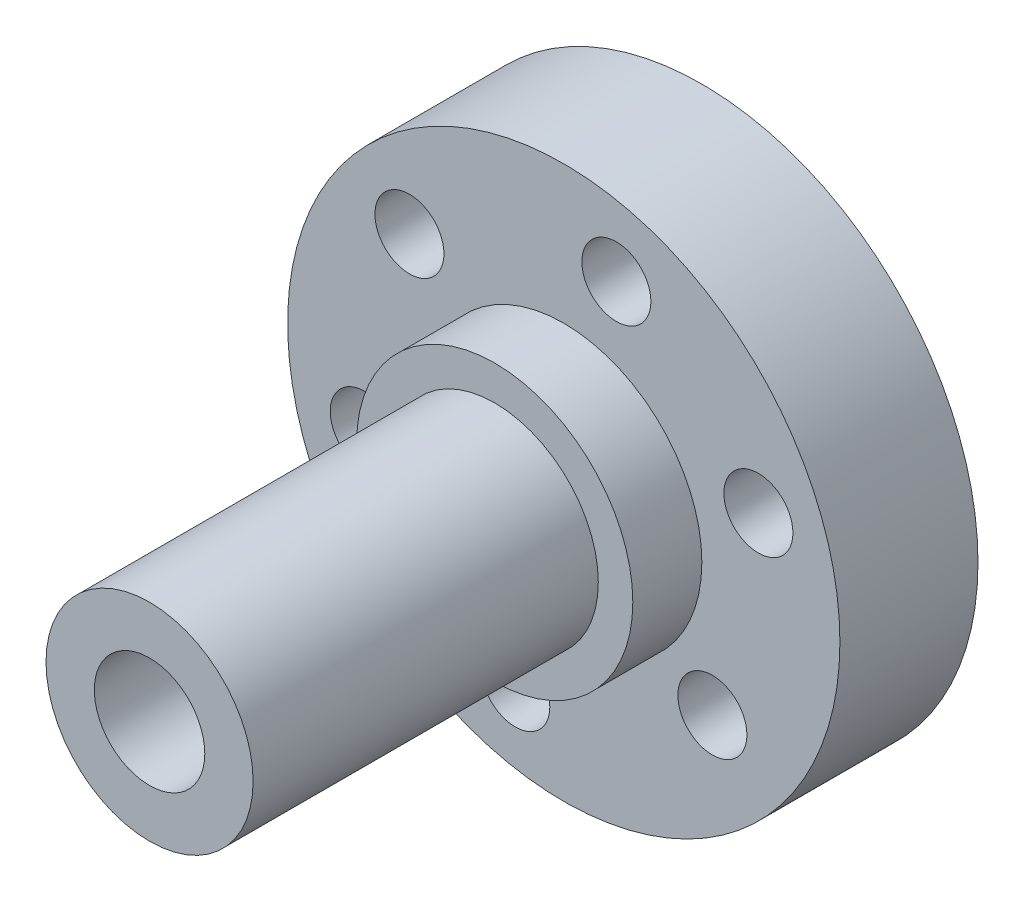
ISO-10303-21;
HEADER;
FILE_DESCRIPTION(('STEP AP214'),'2;1');
FILE_NAME('part.step','',(''),(''),'','','');
FILE_SCHEMA(('AUTOMOTIVE_DESIGN { 1 0 10303 214 1 1 1 1 }'));
ENDSEC;
DATA;
#1=APPLICATION_CONTEXT('core data for automotive mechanical design processes');
#2=APPLICATION_PROTOCOL_DEFINITION('international standard','automotive_design',2000,#1);
#3=PRODUCT_CONTEXT('',#1,'mechanical');
#4=PRODUCT('Part','Part','',(#3));
#5=PRODUCT_RELATED_PRODUCT_CATEGORY('part','',(#4));
#6=PRODUCT_DEFINITION_FORMATION('','',#4);
#7=PRODUCT_DEFINITION_CONTEXT('part definition',#1,'design');
#8=PRODUCT_DEFINITION('design','',#6,#7);
#9=PRODUCT_DEFINITION_SHAPE('','',#8);
#10=(LENGTH_UNIT() NAMED_UNIT(*) SI_UNIT(.MILLI.,.METRE.));
#11=(NAMED_UNIT(*) PLANE_ANGLE_UNIT() SI_UNIT($,.RADIAN.));
#12=(NAMED_UNIT(*) SI_UNIT($,.STERADIAN.) SOLID_ANGLE_UNIT());
#13=UNCERTAINTY_MEASURE_WITH_UNIT(LENGTH_MEASURE(1.E-05),#10,'distance_accuracy_value','');
#14=(GEOMETRIC_REPRESENTATION_CONTEXT(3) GLOBAL_UNCERTAINTY_ASSIGNED_CONTEXT((#13)) GLOBAL_UNIT_ASSIGNED_CONTEXT((#10,
#11,#12)) REPRESENTATION_CONTEXT('',''));
#15=CARTESIAN_POINT('',(0.,0.,0.));
#16=DIRECTION('',(0.,0.,1.));
#17=DIRECTION('',(1.,0.,0.));
#18=AXIS2_PLACEMENT_3D('',#15,#16,#17);
#19=CARTESIAN_POINT('',(0.,0.,10.));
#20=DIRECTION('',(0.,0.,1.));
#21=DIRECTION('',(1.,0.,0.));
#22=AXIS2_PLACEMENT_3D('',#19,#20,#21);
#23=PLANE('',#22);
#24=CARTESIAN_POINT('',(-11.1788768629979,10.0016354703583,10.));
#25=DIRECTION('',(0.,0.,1.));
#26=DIRECTION('',(1.,0.,0.));
#27=AXIS2_PLACEMENT_3D('',#24,#25,#26);
#28=CIRCLE('',#27,2.5);
#29=CARTESIAN_POINT('',(-8.67887686299794,10.0016354703583,10.));
#30=VERTEX_POINT('',#29);
#31=EDGE_CURVE('E134',#30,#30,#28,.T.);
#32=ORIENTED_EDGE('',*,*,#31,.F.);
#33=EDGE_LOOP('',(#32));
#34=FACE_BOUND('',#33,.T.);
#35=CARTESIAN_POINT('',(-3.5112806610739,-14.5832406590294,10.));
#36=DIRECTION('',(0.,0.,1.));
#37=DIRECTION('',(1.,0.,0.));
#38=AXIS2_PLACEMENT_3D('',#35,#36,#37);
#39=CIRCLE('',#38,2.50000000000001);
#40=CARTESIAN_POINT('',(-1.01128066107388,-14.5832406590294,10.));
#41=VERTEX_POINT('',#40);
#42=EDGE_CURVE('E150',#41,#41,#39,.T.);
#43=ORIENTED_EDGE('',*,*,#42,.F.);
#44=EDGE_LOOP('',(#43));
#45=FACE_BOUND('',#44,.T.);
#46=CARTESIAN_POINT('',(14.0954175244304,5.13022463562567,10.));
#47=DIRECTION('',(0.,0.,1.));
#48=DIRECTION('',(1.,0.,0.));
#49=AXIS2_PLACEMENT_3D('',#46,#47,#48);
#50=CIRCLE('',#49,2.5);
#51=CARTESIAN_POINT('',(16.5954175244304,5.13022463562567,10.));
#52=VERTEX_POINT('',#51);
#53=EDGE_CURVE('E166',#52,#52,#50,.T.);
#54=ORIENTED_EDGE('',*,*,#53,.F.);
#55=EDGE_LOOP('',(#54));
#56=FACE_BOUND('',#55,.T.);
#57=CARTESIAN_POINT('',(0.,0.,10.));
#58=DIRECTION('',(0.,0.,1.));
#59=DIRECTION('',(1.,0.,0.));
#60=AXIS2_PLACEMENT_3D('',#57,#58,#59);
#61=CIRCLE('',#60,20.);
#62=CARTESIAN_POINT('',(20.,0.,10.));
#63=VERTEX_POINT('',#62);
#64=EDGE_CURVE('E182',#63,#63,#61,.T.);
#65=ORIENTED_EDGE('',*,*,#64,.T.);
#66=EDGE_LOOP('',(#65));
#67=FACE_BOUND('',#66,.T.);
#68=CARTESIAN_POINT('',(3.80920927033514,14.5082709078233,10.));
#69=DIRECTION('',(0.,0.,1.));
#70=DIRECTION('',(1.,0.,0.));
#71=AXIS2_PLACEMENT_3D('',#68,#69,#70);
#72=CIRCLE('',#71,2.50000000000001);
#73=CARTESIAN_POINT('',(6.30920927033515,14.5082709078233,10.));
#74=VERTEX_POINT('',#73);
#75=EDGE_CURVE('E174',#74,#74,#72,.T.);
#76=ORIENTED_EDGE('',*,*,#75,.F.);
#77=EDGE_LOOP('',(#76));
#78=FACE_BOUND('',#77,.T.);
#79=CARTESIAN_POINT('',(10.7636050705033,-9.2027740018437,10.));
#80=DIRECTION('',(0.,0.,1.));
#81=DIRECTION('',(1.,0.,0.));
#82=AXIS2_PLACEMENT_3D('',#79,#80,#81);
#83=CIRCLE('',#82,2.50000000000001);
#84=CARTESIAN_POINT('',(13.2636050705033,-9.2027740018437,10.));
#85=VERTEX_POINT('',#84);
#86=EDGE_CURVE('E158',#85,#85,#83,.T.);
#87=ORIENTED_EDGE('',*,*,#86,.F.);
#88=EDGE_LOOP('',(#87));
#89=FACE_BOUND('',#88,.T.);
#90=CARTESIAN_POINT('',(-14.4157880750491,-3.98367754582332,10.));
#91=DIRECTION('',(0.,0.,1.));
#92=DIRECTION('',(1.,0.,0.));
#93=AXIS2_PLACEMENT_3D('',#90,#91,#92);
#94=CIRCLE('',#93,2.5);
#95=CARTESIAN_POINT('',(-11.9157880750491,-3.98367754582332,10.));
#96=VERTEX_POINT('',#95);
#97=EDGE_CURVE('E142',#96,#96,#94,.T.);
#98=ORIENTED_EDGE('',*,*,#97,.F.);
#99=EDGE_LOOP('',(#98));
#100=FACE_BOUND('',#99,.T.);
#101=CARTESIAN_POINT('',(0.,0.,10.));
#102=DIRECTION('',(0.,0.,1.));
#103=DIRECTION('',(1.,0.,0.));
#104=AXIS2_PLACEMENT_3D('',#101,#102,#103);
#105=CIRCLE('',#104,10.);
#106=CARTESIAN_POINT('',(10.,0.,10.));
#107=VERTEX_POINT('',#106);
#108=EDGE_CURVE('E207',#107,#107,#105,.T.);
#109=ORIENTED_EDGE('',*,*,#108,.F.);
#110=EDGE_LOOP('',(#109));
#111=FACE_BOUND('',#110,.T.);
#112=ADVANCED_FACE('F45',(#34,#45,#56,#67,#78,#89,#100,#111),#23,.T.);
#113=CARTESIAN_POINT('',(0.,0.,0.));
#114=DIRECTION('',(0.,0.,1.));
#115=DIRECTION('',(1.,0.,0.));
#116=AXIS2_PLACEMENT_3D('',#113,#114,#115);
#117=PLANE('',#116);
#118=DIRECTION('',(1.,0.,0.));
#119=VECTOR('',#118,1.);
#120=CARTESIAN_POINT('',(1.5,1.5,0.));
#121=LINE('',#120,#119);
#122=CARTESIAN_POINT('',(-1.5,1.5,0.));
#123=VERTEX_POINT('',#122);
#124=CARTESIAN_POINT('',(1.5,1.5,0.));
#125=VERTEX_POINT('',#124);
#126=EDGE_CURVE('E99',#123,#125,#121,.T.);
#127=ORIENTED_EDGE('',*,*,#126,.F.);
#128=DIRECTION('',(0.,1.,0.));
#129=VECTOR('',#128,1.);
#130=CARTESIAN_POINT('',(-1.5,1.5,0.));
#131=LINE('',#130,#129);
#132=CARTESIAN_POINT('',(-1.5,-1.5,0.));
#133=VERTEX_POINT('',#132);
#134=EDGE_CURVE('E61',#133,#123,#131,.T.);
#135=ORIENTED_EDGE('',*,*,#134,.F.);
#136=DIRECTION('',(-1.,0.,0.));
#137=VECTOR('',#136,1.);
#138=CARTESIAN_POINT('',(1.5,-1.5,0.));
#139=LINE('',#138,#137);
#140=CARTESIAN_POINT('',(1.5,-1.5,0.));
#141=VERTEX_POINT('',#140);
#142=EDGE_CURVE('E107',#141,#133,#139,.T.);
#143=ORIENTED_EDGE('',*,*,#142,.F.);
#144=DIRECTION('',(0.,-1.,0.));
#145=VECTOR('',#144,1.);
#146=CARTESIAN_POINT('',(1.5,1.5,0.));
#147=LINE('',#146,#145);
#148=EDGE_CURVE('E89',#125,#141,#147,.T.);
#149=ORIENTED_EDGE('',*,*,#148,.F.);
#150=EDGE_LOOP('',(#127,#135,#143,#149));
#151=FACE_BOUND('',#150,.T.);
#152=CARTESIAN_POINT('',(0.,0.,0.));
#153=DIRECTION('',(0.,0.,1.));
#154=DIRECTION('',(1.,0.,0.));
#155=AXIS2_PLACEMENT_3D('',#152,#153,#154);
#156=CIRCLE('',#155,20.);
#157=CARTESIAN_POINT('',(20.,0.,0.));
#158=VERTEX_POINT('',#157);
#159=EDGE_CURVE('E178',#158,#158,#156,.T.);
#160=ORIENTED_EDGE('',*,*,#159,.F.);
#161=EDGE_LOOP('',(#160));
#162=FACE_BOUND('',#161,.T.);
#163=CARTESIAN_POINT('',(3.80920927033514,14.5082709078233,0.));
#164=DIRECTION('',(0.,0.,1.));
#165=DIRECTION('',(1.,0.,0.));
#166=AXIS2_PLACEMENT_3D('',#163,#164,#165);
#167=CIRCLE('',#166,2.50000000000001);
#168=CARTESIAN_POINT('',(6.30920927033515,14.5082709078233,0.));
#169=VERTEX_POINT('',#168);
#170=EDGE_CURVE('E170',#169,#169,#167,.T.);
#171=ORIENTED_EDGE('',*,*,#170,.T.);
#172=EDGE_LOOP('',(#171));
#173=FACE_BOUND('',#172,.T.);
#174=CARTESIAN_POINT('',(14.0954175244304,5.13022463562567,0.));
#175=DIRECTION('',(0.,0.,1.));
#176=DIRECTION('',(1.,0.,0.));
#177=AXIS2_PLACEMENT_3D('',#174,#175,#176);
#178=CIRCLE('',#177,2.5);
#179=CARTESIAN_POINT('',(16.5954175244304,5.13022463562567,0.));
#180=VERTEX_POINT('',#179);
#181=EDGE_CURVE('E162',#180,#180,#178,.T.);
#182=ORIENTED_EDGE('',*,*,#181,.T.);
#183=EDGE_LOOP('',(#182));
#184=FACE_BOUND('',#183,.T.);
#185=CARTESIAN_POINT('',(10.7636050705033,-9.2027740018437,0.));
#186=DIRECTION('',(0.,0.,1.));
#187=DIRECTION('',(1.,0.,0.));
#188=AXIS2_PLACEMENT_3D('',#185,#186,#187);
#189=CIRCLE('',#188,2.50000000000001);
#190=CARTESIAN_POINT('',(13.2636050705033,-9.2027740018437,0.));
#191=VERTEX_POINT('',#190);
#192=EDGE_CURVE('E154',#191,#191,#189,.T.);
#193=ORIENTED_EDGE('',*,*,#192,.T.);
#194=EDGE_LOOP('',(#193));
#195=FACE_BOUND('',#194,.T.);
#196=CARTESIAN_POINT('',(-3.5112806610739,-14.5832406590294,0.));
#197=DIRECTION('',(0.,0.,1.));
#198=DIRECTION('',(1.,0.,0.));
#199=AXIS2_PLACEMENT_3D('',#196,#197,#198);
#200=CIRCLE('',#199,2.50000000000001);
#201=CARTESIAN_POINT('',(-1.01128066107388,-14.5832406590294,0.));
#202=VERTEX_POINT('',#201);
#203=EDGE_CURVE('E146',#202,#202,#200,.T.);
#204=ORIENTED_EDGE('',*,*,#203,.T.);
#205=EDGE_LOOP('',(#204));
#206=FACE_BOUND('',#205,.T.);
#207=CARTESIAN_POINT('',(-14.4157880750491,-3.98367754582332,0.));
#208=DIRECTION('',(0.,0.,1.));
#209=DIRECTION('',(1.,0.,0.));
#210=AXIS2_PLACEMENT_3D('',#207,#208,#209);
#211=CIRCLE('',#210,2.5);
#212=CARTESIAN_POINT('',(-11.9157880750491,-3.98367754582332,0.));
#213=VERTEX_POINT('',#212);
#214=EDGE_CURVE('E138',#213,#213,#211,.T.);
#215=ORIENTED_EDGE('',*,*,#214,.T.);
#216=EDGE_LOOP('',(#215));
#217=FACE_BOUND('',#216,.T.);
#218=CARTESIAN_POINT('',(-11.1788768629979,10.0016354703583,0.));
#219=DIRECTION('',(0.,0.,1.));
#220=DIRECTION('',(1.,0.,0.));
#221=AXIS2_PLACEMENT_3D('',#218,#219,#220);
#222=CIRCLE('',#221,2.5);
#223=CARTESIAN_POINT('',(-8.67887686299794,10.0016354703583,0.));
#224=VERTEX_POINT('',#223);
#225=EDGE_CURVE('E133',#224,#224,#222,.T.);
#226=ORIENTED_EDGE('',*,*,#225,.T.);
#227=EDGE_LOOP('',(#226));
#228=FACE_BOUND('',#227,.T.);
#229=ADVANCED_FACE('F104',(#151,#162,#173,#184,#195,#206,#217,#228),#117,.F.);
#230=CARTESIAN_POINT('',(0.,0.,10.));
#231=DIRECTION('',(0.,0.,-1.));
#232=DIRECTION('',(-1.,0.,0.));
#233=AXIS2_PLACEMENT_3D('',#230,#231,#232);
#234=CYLINDRICAL_SURFACE('',#233,20.);
#235=ORIENTED_EDGE('',*,*,#64,.F.);
#236=EDGE_LOOP('',(#235));
#237=FACE_BOUND('',#236,.T.);
#238=ORIENTED_EDGE('',*,*,#159,.T.);
#239=EDGE_LOOP('',(#238));
#240=FACE_BOUND('',#239,.T.);
#241=ADVANCED_FACE('F47',(#237,#240),#234,.T.);
#242=CARTESIAN_POINT('',(3.80920927033514,14.5082709078233,10.));
#243=DIRECTION('',(0.,0.,-1.));
#244=DIRECTION('',(-1.,0.,0.));
#245=AXIS2_PLACEMENT_3D('',#242,#243,#244);
#246=CYLINDRICAL_SURFACE('',#245,2.50000000000001);
#247=ORIENTED_EDGE('',*,*,#75,.T.);
#248=EDGE_LOOP('',(#247));
#249=FACE_BOUND('',#248,.T.);
#250=ORIENTED_EDGE('',*,*,#170,.F.);
#251=EDGE_LOOP('',(#250));
#252=FACE_BOUND('',#251,.T.);
#253=ADVANCED_FACE('F242',(#249,#252),#246,.F.);
#254=CARTESIAN_POINT('',(14.0954175244304,5.13022463562567,10.));
#255=DIRECTION('',(0.,0.,-1.));
#256=DIRECTION('',(-1.,0.,0.));
#257=AXIS2_PLACEMENT_3D('',#254,#255,#256);
#258=CYLINDRICAL_SURFACE('',#257,2.5);
#259=ORIENTED_EDGE('',*,*,#53,.T.);
#260=EDGE_LOOP('',(#259));
#261=FACE_BOUND('',#260,.T.);
#262=ORIENTED_EDGE('',*,*,#181,.F.);
#263=EDGE_LOOP('',(#262));
#264=FACE_BOUND('',#263,.T.);
#265=ADVANCED_FACE('F245',(#261,#264),#258,.F.);
#266=CARTESIAN_POINT('',(10.7636050705033,-9.2027740018437,10.));
#267=DIRECTION('',(0.,0.,-1.));
#268=DIRECTION('',(-1.,0.,0.));
#269=AXIS2_PLACEMENT_3D('',#266,#267,#268);
#270=CYLINDRICAL_SURFACE('',#269,2.50000000000001);
#271=ORIENTED_EDGE('',*,*,#86,.T.);
#272=EDGE_LOOP('',(#271));
#273=FACE_BOUND('',#272,.T.);
#274=ORIENTED_EDGE('',*,*,#192,.F.);
#275=EDGE_LOOP('',(#274));
#276=FACE_BOUND('',#275,.T.);
#277=ADVANCED_FACE('F249',(#273,#276),#270,.F.);
#278=CARTESIAN_POINT('',(-3.5112806610739,-14.5832406590294,10.));
#279=DIRECTION('',(0.,0.,-1.));
#280=DIRECTION('',(-1.,0.,0.));
#281=AXIS2_PLACEMENT_3D('',#278,#279,#280);
#282=CYLINDRICAL_SURFACE('',#281,2.50000000000001);
#283=ORIENTED_EDGE('',*,*,#42,.T.);
#284=EDGE_LOOP('',(#283));
#285=FACE_BOUND('',#284,.T.);
#286=ORIENTED_EDGE('',*,*,#203,.F.);
#287=EDGE_LOOP('',(#286));
#288=FACE_BOUND('',#287,.T.);
#289=ADVANCED_FACE('F253',(#285,#288),#282,.F.);
#290=CARTESIAN_POINT('',(-14.4157880750491,-3.98367754582332,10.));
#291=DIRECTION('',(0.,0.,-1.));
#292=DIRECTION('',(-1.,0.,0.));
#293=AXIS2_PLACEMENT_3D('',#290,#291,#292);
#294=CYLINDRICAL_SURFACE('',#293,2.5);
#295=ORIENTED_EDGE('',*,*,#97,.T.);
#296=EDGE_LOOP('',(#295));
#297=FACE_BOUND('',#296,.T.);
#298=ORIENTED_EDGE('',*,*,#214,.F.);
#299=EDGE_LOOP('',(#298));
#300=FACE_BOUND('',#299,.T.);
#301=ADVANCED_FACE('F257',(#297,#300),#294,.F.);
#302=CARTESIAN_POINT('',(-11.1788768629979,10.0016354703583,10.));
#303=DIRECTION('',(0.,0.,-1.));
#304=DIRECTION('',(-1.,0.,0.));
#305=AXIS2_PLACEMENT_3D('',#302,#303,#304);
#306=CYLINDRICAL_SURFACE('',#305,2.5);
#307=ORIENTED_EDGE('',*,*,#31,.T.);
#308=EDGE_LOOP('',(#307));
#309=FACE_BOUND('',#308,.T.);
#310=ORIENTED_EDGE('',*,*,#225,.F.);
#311=EDGE_LOOP('',(#310));
#312=FACE_BOUND('',#311,.T.);
#313=ADVANCED_FACE('F261',(#309,#312),#306,.F.);
#314=CARTESIAN_POINT('',(0.,0.,40.));
#315=DIRECTION('',(0.,0.,-1.));
#316=DIRECTION('',(-1.,0.,0.));
#317=AXIS2_PLACEMENT_3D('',#314,#315,#316);
#318=CYLINDRICAL_SURFACE('',#317,7.5);
#319=CARTESIAN_POINT('',(0.,0.,15.));
#320=DIRECTION('',(0.,0.,1.));
#321=DIRECTION('',(1.,0.,0.));
#322=AXIS2_PLACEMENT_3D('',#319,#320,#321);
#323=CIRCLE('',#322,7.5);
#324=CARTESIAN_POINT('',(7.5,0.,15.));
#325=VERTEX_POINT('',#324);
#326=EDGE_CURVE('E212',#325,#325,#323,.T.);
#327=ORIENTED_EDGE('',*,*,#326,.T.);
#328=EDGE_LOOP('',(#327));
#329=FACE_BOUND('',#328,.T.);
#330=CARTESIAN_POINT('',(0.,0.,40.));
#331=DIRECTION('',(0.,0.,1.));
#332=DIRECTION('',(1.,0.,0.));
#333=AXIS2_PLACEMENT_3D('',#330,#331,#332);
#334=CIRCLE('',#333,7.5);
#335=CARTESIAN_POINT('',(7.5,0.,40.));
#336=VERTEX_POINT('',#335);
#337=EDGE_CURVE('E126',#336,#336,#334,.T.);
#338=ORIENTED_EDGE('',*,*,#337,.F.);
#339=EDGE_LOOP('',(#338));
#340=FACE_BOUND('',#339,.T.);
#341=ADVANCED_FACE('F218',(#329,#340),#318,.T.);
#342=CARTESIAN_POINT('',(0.,0.,40.));
#343=DIRECTION('',(0.,0.,1.));
#344=DIRECTION('',(1.,0.,0.));
#345=AXIS2_PLACEMENT_3D('',#342,#343,#344);
#346=PLANE('',#345);
#347=CARTESIAN_POINT('',(0.,0.,40.));
#348=DIRECTION('',(0.,0.,1.));
#349=DIRECTION('',(1.,0.,0.));
#350=AXIS2_PLACEMENT_3D('',#347,#348,#349);
#351=CIRCLE('',#350,4.);
#352=CARTESIAN_POINT('',(4.,0.,40.));
#353=VERTEX_POINT('',#352);
#354=EDGE_CURVE('E117',#353,#353,#351,.T.);
#355=ORIENTED_EDGE('',*,*,#354,.F.);
#356=EDGE_LOOP('',(#355));
#357=FACE_BOUND('',#356,.T.);
#358=ORIENTED_EDGE('',*,*,#337,.T.);
#359=EDGE_LOOP('',(#358));
#360=FACE_BOUND('',#359,.T.);
#361=ADVANCED_FACE('F268',(#357,#360),#346,.T.);
#362=CARTESIAN_POINT('',(0.,0.,10.));
#363=DIRECTION('',(0.,0.,1.));
#364=DIRECTION('',(1.,0.,0.));
#365=AXIS2_PLACEMENT_3D('',#362,#363,#364);
#366=CYLINDRICAL_SURFACE('',#365,4.);
#367=CARTESIAN_POINT('',(0.,0.,10.));
#368=DIRECTION('',(0.,0.,1.));
#369=DIRECTION('',(1.,0.,0.));
#370=AXIS2_PLACEMENT_3D('',#367,#368,#369);
#371=CIRCLE('',#370,4.);
#372=CARTESIAN_POINT('',(4.,0.,10.));
#373=VERTEX_POINT('',#372);
#374=EDGE_CURVE('E122',#373,#373,#371,.T.);
#375=ORIENTED_EDGE('',*,*,#374,.F.);
#376=EDGE_LOOP('',(#375));
#377=FACE_BOUND('',#376,.T.);
#378=ORIENTED_EDGE('',*,*,#354,.T.);
#379=EDGE_LOOP('',(#378));
#380=FACE_BOUND('',#379,.T.);
#381=ADVANCED_FACE('F271',(#377,#380),#366,.F.);
#382=CARTESIAN_POINT('',(0.,0.,10.));
#383=DIRECTION('',(0.,0.,1.));
#384=DIRECTION('',(1.,0.,0.));
#385=AXIS2_PLACEMENT_3D('',#382,#383,#384);
#386=PLANE('',#385);
#387=DIRECTION('',(0.,-1.,0.));
#388=VECTOR('',#387,1.);
#389=CARTESIAN_POINT('',(-1.5,0.,10.));
#390=LINE('',#389,#388);
#391=CARTESIAN_POINT('',(-1.5,1.5,10.));
#392=VERTEX_POINT('',#391);
#393=CARTESIAN_POINT('',(-1.5,-1.5,10.));
#394=VERTEX_POINT('',#393);
#395=EDGE_CURVE('E11',#392,#394,#390,.T.);
#396=ORIENTED_EDGE('',*,*,#395,.F.);
#397=DIRECTION('',(-1.,0.,0.));
#398=VECTOR('',#397,1.);
#399=CARTESIAN_POINT('',(0.,1.5,10.));
#400=LINE('',#399,#398);
#401=CARTESIAN_POINT('',(1.5,1.5,10.));
#402=VERTEX_POINT('',#401);
#403=EDGE_CURVE('E186',#402,#392,#400,.T.);
#404=ORIENTED_EDGE('',*,*,#403,.F.);
#405=DIRECTION('',(0.,1.,0.));
#406=VECTOR('',#405,1.);
#407=CARTESIAN_POINT('',(1.5,0.,10.));
#408=LINE('',#407,#406);
#409=CARTESIAN_POINT('',(1.5,-1.5,10.));
#410=VERTEX_POINT('',#409);
#411=EDGE_CURVE('E92',#410,#402,#408,.T.);
#412=ORIENTED_EDGE('',*,*,#411,.F.);
#413=DIRECTION('',(1.,0.,0.));
#414=VECTOR('',#413,1.);
#415=CARTESIAN_POINT('',(0.,-1.5,10.));
#416=LINE('',#415,#414);
#417=EDGE_CURVE('E54',#394,#410,#416,.T.);
#418=ORIENTED_EDGE('',*,*,#417,.F.);
#419=EDGE_LOOP('',(#396,#404,#412,#418));
#420=FACE_BOUND('',#419,.T.);
#421=ORIENTED_EDGE('',*,*,#374,.T.);
#422=EDGE_LOOP('',(#421));
#423=FACE_BOUND('',#422,.T.);
#424=ADVANCED_FACE('F200',(#420,#423),#386,.T.);
#425=CARTESIAN_POINT('',(-1.5,1.5,20.));
#426=DIRECTION('',(-1.,0.,0.));
#427=DIRECTION('',(0.,-1.,0.));
#428=AXIS2_PLACEMENT_3D('',#425,#426,#427);
#429=PLANE('',#428);
#430=ORIENTED_EDGE('',*,*,#395,.T.);
#431=DIRECTION('',(0.,0.,-1.));
#432=VECTOR('',#431,1.);
#433=CARTESIAN_POINT('',(-1.5,-1.5,20.));
#434=LINE('',#433,#432);
#435=EDGE_CURVE('E114',#394,#133,#434,.T.);
#436=ORIENTED_EDGE('',*,*,#435,.T.);
#437=ORIENTED_EDGE('',*,*,#134,.T.);
#438=DIRECTION('',(0.,0.,-1.));
#439=VECTOR('',#438,1.);
#440=CARTESIAN_POINT('',(-1.5,1.5,20.));
#441=LINE('',#440,#439);
#442=EDGE_CURVE('E96',#392,#123,#441,.T.);
#443=ORIENTED_EDGE('',*,*,#442,.F.);
#444=EDGE_LOOP('',(#430,#436,#437,#443));
#445=FACE_BOUND('',#444,.T.);
#446=ADVANCED_FACE('F202',(#445),#429,.F.);
#447=CARTESIAN_POINT('',(1.5,-1.5,20.));
#448=DIRECTION('',(0.,-1.,0.));
#449=DIRECTION('',(0.,0.,-1.));
#450=AXIS2_PLACEMENT_3D('',#447,#448,#449);
#451=PLANE('',#450);
#452=ORIENTED_EDGE('',*,*,#417,.T.);
#453=DIRECTION('',(0.,0.,-1.));
#454=VECTOR('',#453,1.);
#455=CARTESIAN_POINT('',(1.5,-1.5,20.));
#456=LINE('',#455,#454);
#457=EDGE_CURVE('E95',#410,#141,#456,.T.);
#458=ORIENTED_EDGE('',*,*,#457,.T.);
#459=ORIENTED_EDGE('',*,*,#142,.T.);
#460=ORIENTED_EDGE('',*,*,#435,.F.);
#461=EDGE_LOOP('',(#452,#458,#459,#460));
#462=FACE_BOUND('',#461,.T.);
#463=ADVANCED_FACE('F197',(#462),#451,.F.);
#464=CARTESIAN_POINT('',(1.5,1.5,20.));
#465=DIRECTION('',(1.,0.,0.));
#466=DIRECTION('',(0.,1.,0.));
#467=AXIS2_PLACEMENT_3D('',#464,#465,#466);
#468=PLANE('',#467);
#469=ORIENTED_EDGE('',*,*,#411,.T.);
#470=DIRECTION('',(0.,0.,-1.));
#471=VECTOR('',#470,1.);
#472=CARTESIAN_POINT('',(1.5,1.5,20.));
#473=LINE('',#472,#471);
#474=EDGE_CURVE('E69',#402,#125,#473,.T.);
#475=ORIENTED_EDGE('',*,*,#474,.T.);
#476=ORIENTED_EDGE('',*,*,#148,.T.);
#477=ORIENTED_EDGE('',*,*,#457,.F.);
#478=EDGE_LOOP('',(#469,#475,#476,#477));
#479=FACE_BOUND('',#478,.T.);
#480=ADVANCED_FACE('F86',(#479),#468,.F.);
#481=CARTESIAN_POINT('',(1.5,1.5,20.));
#482=DIRECTION('',(0.,1.,0.));
#483=DIRECTION('',(0.,0.,1.));
#484=AXIS2_PLACEMENT_3D('',#481,#482,#483);
#485=PLANE('',#484);
#486=ORIENTED_EDGE('',*,*,#403,.T.);
#487=ORIENTED_EDGE('',*,*,#442,.T.);
#488=ORIENTED_EDGE('',*,*,#126,.T.);
#489=ORIENTED_EDGE('',*,*,#474,.F.);
#490=EDGE_LOOP('',(#486,#487,#488,#489));
#491=FACE_BOUND('',#490,.T.);
#492=ADVANCED_FACE('F100',(#491),#485,.F.);
#493=CARTESIAN_POINT('',(0.,0.,15.));
#494=DIRECTION('',(0.,0.,1.));
#495=DIRECTION('',(1.,0.,0.));
#496=AXIS2_PLACEMENT_3D('',#493,#494,#495);
#497=PLANE('',#496);
#498=CARTESIAN_POINT('',(0.,0.,15.));
#499=DIRECTION('',(0.,0.,1.));
#500=DIRECTION('',(1.,0.,0.));
#501=AXIS2_PLACEMENT_3D('',#498,#499,#500);
#502=CIRCLE('',#501,10.);
#503=CARTESIAN_POINT('',(10.,0.,15.));
#504=VERTEX_POINT('',#503);
#505=EDGE_CURVE('E204',#504,#504,#502,.T.);
#506=ORIENTED_EDGE('',*,*,#505,.T.);
#507=EDGE_LOOP('',(#506));
#508=FACE_BOUND('',#507,.T.);
#509=ORIENTED_EDGE('',*,*,#326,.F.);
#510=EDGE_LOOP('',(#509));
#511=FACE_BOUND('',#510,.T.);
#512=ADVANCED_FACE('F221',(#508,#511),#497,.T.);
#513=CARTESIAN_POINT('',(0.,0.,15.));
#514=DIRECTION('',(0.,0.,-1.));
#515=DIRECTION('',(-1.,0.,0.));
#516=AXIS2_PLACEMENT_3D('',#513,#514,#515);
#517=CYLINDRICAL_SURFACE('',#516,10.);
#518=ORIENTED_EDGE('',*,*,#505,.F.);
#519=EDGE_LOOP('',(#518));
#520=FACE_BOUND('',#519,.T.);
#521=ORIENTED_EDGE('',*,*,#108,.T.);
#522=EDGE_LOOP('',(#521));
#523=FACE_BOUND('',#522,.T.);
#524=ADVANCED_FACE('F223',(#520,#523),#517,.T.);
#525=CLOSED_SHELL('',(#112,#229,#241,#253,#265,#277,#289,#301,#313,#341,#361,#381,#424,#446,
#463,#480,#492,#512,#524));
#526=MANIFOLD_SOLID_BREP('B2',#525);
#527=ADVANCED_BREP_SHAPE_REPRESENTATION('',(#18,#526),#14);
#528=SHAPE_DEFINITION_REPRESENTATION(#9,#527);
ENDSEC;
END-ISO-10303-21;
